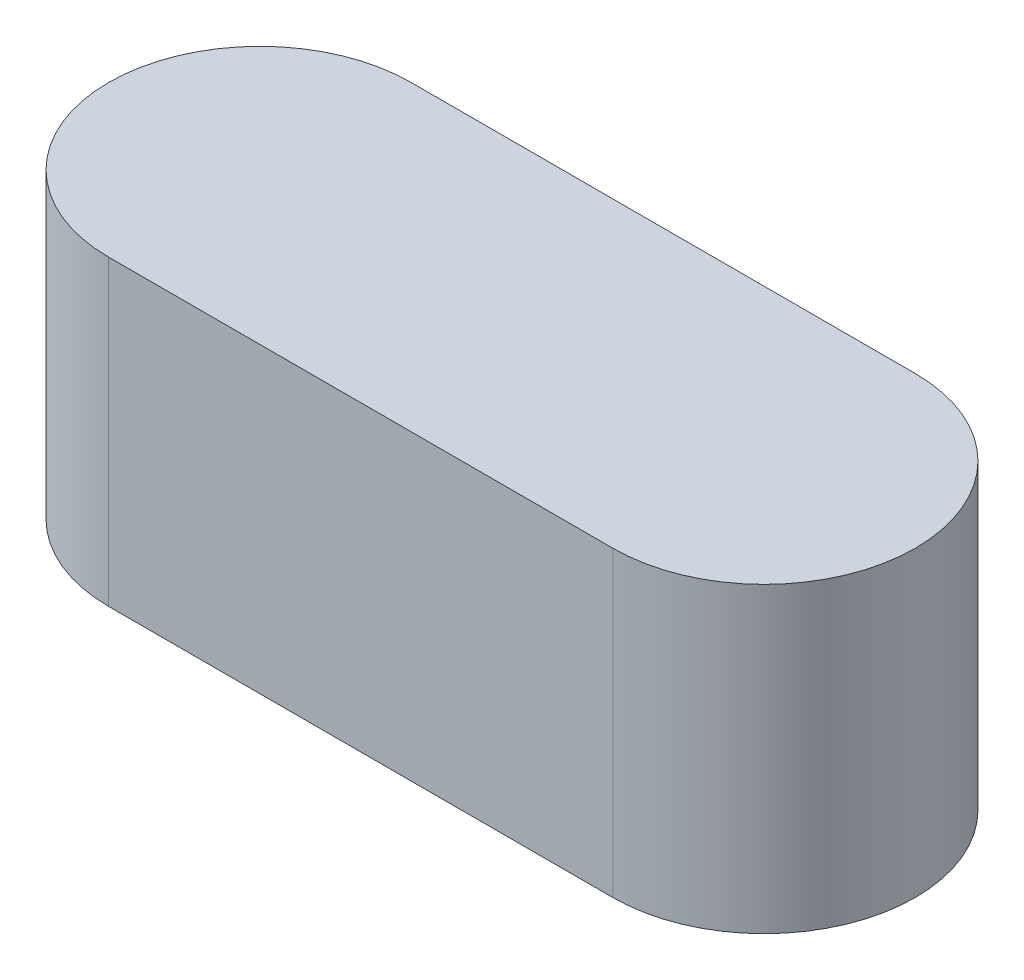
ISO-10303-21;
HEADER;
FILE_DESCRIPTION(('STEP AP214'),'2;1');
FILE_NAME('part.step','',(''),(''),'','','');
FILE_SCHEMA(('AUTOMOTIVE_DESIGN { 1 0 10303 214 1 1 1 1 }'));
ENDSEC;
DATA;
#1=APPLICATION_CONTEXT('core data for automotive mechanical design processes');
#2=APPLICATION_PROTOCOL_DEFINITION('international standard','automotive_design',2000,#1);
#3=PRODUCT_CONTEXT('',#1,'mechanical');
#4=PRODUCT('Part','Part','',(#3));
#5=PRODUCT_RELATED_PRODUCT_CATEGORY('part','',(#4));
#6=PRODUCT_DEFINITION_FORMATION('','',#4);
#7=PRODUCT_DEFINITION_CONTEXT('part definition',#1,'design');
#8=PRODUCT_DEFINITION('design','',#6,#7);
#9=PRODUCT_DEFINITION_SHAPE('','',#8);
#10=(LENGTH_UNIT() NAMED_UNIT(*) SI_UNIT(.MILLI.,.METRE.));
#11=(NAMED_UNIT(*) PLANE_ANGLE_UNIT() SI_UNIT($,.RADIAN.));
#12=(NAMED_UNIT(*) SI_UNIT($,.STERADIAN.) SOLID_ANGLE_UNIT());
#13=UNCERTAINTY_MEASURE_WITH_UNIT(LENGTH_MEASURE(1.E-05),#10,'distance_accuracy_value','');
#14=(GEOMETRIC_REPRESENTATION_CONTEXT(3) GLOBAL_UNCERTAINTY_ASSIGNED_CONTEXT((#13)) GLOBAL_UNIT_ASSIGNED_CONTEXT((#10,
#11,#12)) REPRESENTATION_CONTEXT('',''));
#15=CARTESIAN_POINT('',(0.,0.,0.));
#16=DIRECTION('',(0.,0.,1.));
#17=DIRECTION('',(1.,0.,0.));
#18=AXIS2_PLACEMENT_3D('',#15,#16,#17);
#19=CARTESIAN_POINT('',(0.,6.,0.));
#20=DIRECTION('',(0.,-1.,0.));
#21=DIRECTION('',(0.,0.,-1.));
#22=AXIS2_PLACEMENT_3D('',#19,#20,#21);
#23=CYLINDRICAL_SURFACE('',#22,3.);
#24=CARTESIAN_POINT('',(0.,0.,0.));
#25=DIRECTION('',(0.,1.,0.));
#26=DIRECTION('',(0.,0.,1.));
#27=AXIS2_PLACEMENT_3D('',#24,#25,#26);
#28=CIRCLE('',#27,3.);
#29=CARTESIAN_POINT('',(0.,0.,-3.));
#30=VERTEX_POINT('',#29);
#31=CARTESIAN_POINT('',(0.,0.,3.));
#32=VERTEX_POINT('',#31);
#33=EDGE_CURVE('E102',#30,#32,#28,.T.);
#34=ORIENTED_EDGE('',*,*,#33,.T.);
#35=DIRECTION('',(0.,-1.,0.));
#36=VECTOR('',#35,1.);
#37=CARTESIAN_POINT('',(0.,6.,3.));
#38=LINE('',#37,#36);
#39=CARTESIAN_POINT('',(0.,6.,3.));
#40=VERTEX_POINT('',#39);
#41=EDGE_CURVE('E11',#40,#32,#38,.T.);
#42=ORIENTED_EDGE('',*,*,#41,.F.);
#43=CARTESIAN_POINT('',(0.,6.,0.));
#44=DIRECTION('',(0.,1.,0.));
#45=DIRECTION('',(0.,0.,1.));
#46=AXIS2_PLACEMENT_3D('',#43,#44,#45);
#47=CIRCLE('',#46,3.);
#48=CARTESIAN_POINT('',(0.,6.,-3.));
#49=VERTEX_POINT('',#48);
#50=EDGE_CURVE('E90',#49,#40,#47,.T.);
#51=ORIENTED_EDGE('',*,*,#50,.F.);
#52=DIRECTION('',(0.,-1.,0.));
#53=VECTOR('',#52,1.);
#54=CARTESIAN_POINT('',(0.,6.,-3.));
#55=LINE('',#54,#53);
#56=EDGE_CURVE('E98',#49,#30,#55,.T.);
#57=ORIENTED_EDGE('',*,*,#56,.T.);
#58=EDGE_LOOP('',(#34,#42,#51,#57));
#59=FACE_BOUND('',#58,.T.);
#60=ADVANCED_FACE('F39',(#59),#23,.T.);
#61=CARTESIAN_POINT('',(0.,6.,3.));
#62=DIRECTION('',(0.,0.,-1.));
#63=DIRECTION('',(-1.,0.,0.));
#64=AXIS2_PLACEMENT_3D('',#61,#62,#63);
#65=PLANE('',#64);
#66=DIRECTION('',(1.,0.,0.));
#67=VECTOR('',#66,1.);
#68=CARTESIAN_POINT('',(0.,0.,3.));
#69=LINE('',#68,#67);
#70=CARTESIAN_POINT('',(10.,0.,3.));
#71=VERTEX_POINT('',#70);
#72=EDGE_CURVE('E94',#32,#71,#69,.T.);
#73=ORIENTED_EDGE('',*,*,#72,.T.);
#74=DIRECTION('',(0.,-1.,0.));
#75=VECTOR('',#74,1.);
#76=CARTESIAN_POINT('',(10.,6.,3.));
#77=LINE('',#76,#75);
#78=CARTESIAN_POINT('',(10.,6.,3.));
#79=VERTEX_POINT('',#78);
#80=EDGE_CURVE('E47',#79,#71,#77,.T.);
#81=ORIENTED_EDGE('',*,*,#80,.F.);
#82=DIRECTION('',(1.,0.,0.));
#83=VECTOR('',#82,1.);
#84=CARTESIAN_POINT('',(0.,6.,3.));
#85=LINE('',#84,#83);
#86=EDGE_CURVE('E85',#40,#79,#85,.T.);
#87=ORIENTED_EDGE('',*,*,#86,.F.);
#88=ORIENTED_EDGE('',*,*,#41,.T.);
#89=EDGE_LOOP('',(#73,#81,#87,#88));
#90=FACE_BOUND('',#89,.T.);
#91=ADVANCED_FACE('F93',(#90),#65,.F.);
#92=CARTESIAN_POINT('',(10.,6.,0.));
#93=DIRECTION('',(0.,-1.,0.));
#94=DIRECTION('',(0.,0.,-1.));
#95=AXIS2_PLACEMENT_3D('',#92,#93,#94);
#96=CYLINDRICAL_SURFACE('',#95,3.);
#97=CARTESIAN_POINT('',(10.,0.,0.));
#98=DIRECTION('',(0.,1.,0.));
#99=DIRECTION('',(0.,0.,1.));
#100=AXIS2_PLACEMENT_3D('',#97,#98,#99);
#101=CIRCLE('',#100,3.);
#102=CARTESIAN_POINT('',(10.,0.,-3.));
#103=VERTEX_POINT('',#102);
#104=EDGE_CURVE('E72',#71,#103,#101,.T.);
#105=ORIENTED_EDGE('',*,*,#104,.T.);
#106=DIRECTION('',(0.,-1.,0.));
#107=VECTOR('',#106,1.);
#108=CARTESIAN_POINT('',(10.,6.,-3.));
#109=LINE('',#108,#107);
#110=CARTESIAN_POINT('',(10.,6.,-3.));
#111=VERTEX_POINT('',#110);
#112=EDGE_CURVE('E95',#111,#103,#109,.T.);
#113=ORIENTED_EDGE('',*,*,#112,.F.);
#114=CARTESIAN_POINT('',(10.,6.,0.));
#115=DIRECTION('',(0.,1.,0.));
#116=DIRECTION('',(0.,0.,1.));
#117=AXIS2_PLACEMENT_3D('',#114,#115,#116);
#118=CIRCLE('',#117,3.);
#119=EDGE_CURVE('E88',#79,#111,#118,.T.);
#120=ORIENTED_EDGE('',*,*,#119,.F.);
#121=ORIENTED_EDGE('',*,*,#80,.T.);
#122=EDGE_LOOP('',(#105,#113,#120,#121));
#123=FACE_BOUND('',#122,.T.);
#124=ADVANCED_FACE('F96',(#123),#96,.T.);
#125=CARTESIAN_POINT('',(0.,6.,-3.));
#126=DIRECTION('',(0.,0.,1.));
#127=DIRECTION('',(1.,0.,0.));
#128=AXIS2_PLACEMENT_3D('',#125,#126,#127);
#129=PLANE('',#128);
#130=DIRECTION('',(-1.,0.,0.));
#131=VECTOR('',#130,1.);
#132=CARTESIAN_POINT('',(0.,0.,-3.));
#133=LINE('',#132,#131);
#134=EDGE_CURVE('E78',#103,#30,#133,.T.);
#135=ORIENTED_EDGE('',*,*,#134,.T.);
#136=ORIENTED_EDGE('',*,*,#56,.F.);
#137=DIRECTION('',(-1.,0.,0.));
#138=VECTOR('',#137,1.);
#139=CARTESIAN_POINT('',(0.,6.,-3.));
#140=LINE('',#139,#138);
#141=EDGE_CURVE('E55',#111,#49,#140,.T.);
#142=ORIENTED_EDGE('',*,*,#141,.F.);
#143=ORIENTED_EDGE('',*,*,#112,.T.);
#144=EDGE_LOOP('',(#135,#136,#142,#143));
#145=FACE_BOUND('',#144,.T.);
#146=ADVANCED_FACE('F109',(#145),#129,.F.);
#147=CARTESIAN_POINT('',(0.,6.,0.));
#148=DIRECTION('',(0.,1.,0.));
#149=DIRECTION('',(0.,0.,1.));
#150=AXIS2_PLACEMENT_3D('',#147,#148,#149);
#151=PLANE('',#150);
#152=ORIENTED_EDGE('',*,*,#50,.T.);
#153=ORIENTED_EDGE('',*,*,#86,.T.);
#154=ORIENTED_EDGE('',*,*,#119,.T.);
#155=ORIENTED_EDGE('',*,*,#141,.T.);
#156=EDGE_LOOP('',(#152,#153,#154,#155));
#157=FACE_BOUND('',#156,.T.);
#158=ADVANCED_FACE('F86',(#157),#151,.T.);
#159=CARTESIAN_POINT('',(0.,0.,0.));
#160=DIRECTION('',(0.,1.,0.));
#161=DIRECTION('',(0.,0.,1.));
#162=AXIS2_PLACEMENT_3D('',#159,#160,#161);
#163=PLANE('',#162);
#164=ORIENTED_EDGE('',*,*,#33,.F.);
#165=ORIENTED_EDGE('',*,*,#134,.F.);
#166=ORIENTED_EDGE('',*,*,#104,.F.);
#167=ORIENTED_EDGE('',*,*,#72,.F.);
#168=EDGE_LOOP('',(#164,#165,#166,#167));
#169=FACE_BOUND('',#168,.T.);
#170=ADVANCED_FACE('F112',(#169),#163,.F.);
#171=CLOSED_SHELL('',(#60,#91,#124,#146,#158,#170));
#172=MANIFOLD_SOLID_BREP('B2',#171);
#173=ADVANCED_BREP_SHAPE_REPRESENTATION('',(#18,#172),#14);
#174=SHAPE_DEFINITION_REPRESENTATION(#9,#173);
ENDSEC;
END-ISO-10303-21;
